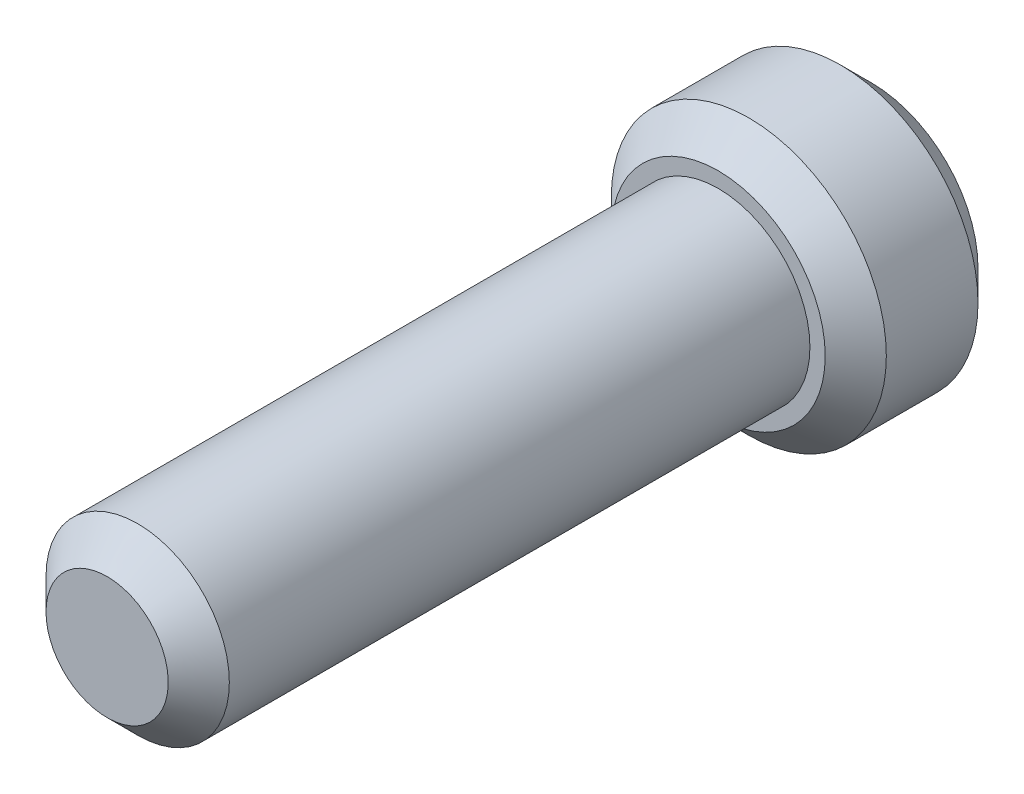
ISO-10303-21;
HEADER;
FILE_DESCRIPTION(('STEP AP214'),'2;1');
FILE_NAME('part.step','',(''),(''),'','','');
FILE_SCHEMA(('AUTOMOTIVE_DESIGN { 1 0 10303 214 1 1 1 1 }'));
ENDSEC;
DATA;
#1=APPLICATION_CONTEXT('core data for automotive mechanical design processes');
#2=APPLICATION_PROTOCOL_DEFINITION('international standard','automotive_design',2000,#1);
#3=PRODUCT_CONTEXT('',#1,'mechanical');
#4=PRODUCT('Part','Part','',(#3));
#5=PRODUCT_RELATED_PRODUCT_CATEGORY('part','',(#4));
#6=PRODUCT_DEFINITION_FORMATION('','',#4);
#7=PRODUCT_DEFINITION_CONTEXT('part definition',#1,'design');
#8=PRODUCT_DEFINITION('design','',#6,#7);
#9=PRODUCT_DEFINITION_SHAPE('','',#8);
#10=(LENGTH_UNIT() NAMED_UNIT(*) SI_UNIT(.MILLI.,.METRE.));
#11=(NAMED_UNIT(*) PLANE_ANGLE_UNIT() SI_UNIT($,.RADIAN.));
#12=(NAMED_UNIT(*) SI_UNIT($,.STERADIAN.) SOLID_ANGLE_UNIT());
#13=UNCERTAINTY_MEASURE_WITH_UNIT(LENGTH_MEASURE(1.E-05),#10,'distance_accuracy_value','');
#14=(GEOMETRIC_REPRESENTATION_CONTEXT(3) GLOBAL_UNCERTAINTY_ASSIGNED_CONTEXT((#13)) GLOBAL_UNIT_ASSIGNED_CONTEXT((#10,
#11,#12)) REPRESENTATION_CONTEXT('',''));
#15=CARTESIAN_POINT('',(0.,0.,0.));
#16=DIRECTION('',(0.,0.,1.));
#17=DIRECTION('',(1.,0.,0.));
#18=AXIS2_PLACEMENT_3D('',#15,#16,#17);
#19=CARTESIAN_POINT('',(-1.299038106,-1.5,1.5));
#20=DIRECTION('',(0.,0.,1.));
#21=DIRECTION('',(1.,0.,0.));
#22=AXIS2_PLACEMENT_3D('',#19,#20,#21);
#23=PLANE('',#22);
#24=DIRECTION('',(-0.866025403838329,0.499999999906659,0.));
#25=VECTOR('',#24,1.);
#26=CARTESIAN_POINT('',(0.,-1.5,1.5));
#27=LINE('',#26,#25);
#28=CARTESIAN_POINT('',(-1.299038105988,-0.750000000006928,1.5));
#29=VERTEX_POINT('',#28);
#30=CARTESIAN_POINT('',(-5.44638257218606E-10,-1.49999999968555,1.5));
#31=VERTEX_POINT('',#30);
#32=EDGE_CURVE('E85',#29,#31,#27,.F.);
#33=ORIENTED_EDGE('',*,*,#32,.F.);
#34=DIRECTION('',(0.,1.,0.));
#35=VECTOR('',#34,1.);
#36=CARTESIAN_POINT('',(-1.299038106,-0.75,1.5));
#37=LINE('',#36,#35);
#38=CARTESIAN_POINT('',(-1.299038106,0.750000000006928,1.5));
#39=VERTEX_POINT('',#38);
#40=EDGE_CURVE('E134',#39,#29,#37,.F.);
#41=ORIENTED_EDGE('',*,*,#40,.F.);
#42=DIRECTION('',(0.866025403838329,0.499999999906659,0.));
#43=VECTOR('',#42,1.);
#44=CARTESIAN_POINT('',(-1.299038106,0.75,1.5));
#45=LINE('',#44,#43);
#46=CARTESIAN_POINT('',(5.44638352086296E-10,1.49999999968555,1.5));
#47=VERTEX_POINT('',#46);
#48=EDGE_CURVE('E128',#47,#39,#45,.F.);
#49=ORIENTED_EDGE('',*,*,#48,.F.);
#50=DIRECTION('',(0.866025403838329,-0.499999999906659,0.));
#51=VECTOR('',#50,1.);
#52=CARTESIAN_POINT('',(0.,1.5,1.5));
#53=LINE('',#52,#51);
#54=CARTESIAN_POINT('',(1.299038105988,0.750000000006928,1.5));
#55=VERTEX_POINT('',#54);
#56=EDGE_CURVE('E74',#55,#47,#53,.F.);
#57=ORIENTED_EDGE('',*,*,#56,.F.);
#58=DIRECTION('',(0.,1.,0.));
#59=VECTOR('',#58,1.);
#60=CARTESIAN_POINT('',(1.299038106,0.75,1.5));
#61=LINE('',#60,#59);
#62=CARTESIAN_POINT('',(1.299038106,-0.750000000006928,1.5));
#63=VERTEX_POINT('',#62);
#64=EDGE_CURVE('E71',#63,#55,#61,.T.);
#65=ORIENTED_EDGE('',*,*,#64,.F.);
#66=DIRECTION('',(-0.866025403838329,-0.499999999906659,0.));
#67=VECTOR('',#66,1.);
#68=CARTESIAN_POINT('',(1.299038106,-0.75,1.5));
#69=LINE('',#68,#67);
#70=EDGE_CURVE('E68',#31,#63,#69,.F.);
#71=ORIENTED_EDGE('',*,*,#70,.F.);
#72=EDGE_LOOP('',(#33,#41,#49,#57,#65,#71));
#73=FACE_BOUND('',#72,.T.);
#74=ADVANCED_FACE('F17',(#73),#23,.F.);
#75=CARTESIAN_POINT('',(1.299038106,0.75,0.));
#76=DIRECTION('',(-1.,0.,0.));
#77=DIRECTION('',(0.,0.,1.));
#78=AXIS2_PLACEMENT_3D('',#75,#76,#77);
#79=PLANE('',#78);
#80=DIRECTION('',(0.,1.,0.));
#81=VECTOR('',#80,1.);
#82=CARTESIAN_POINT('',(1.299038105952,-1.771,0.));
#83=LINE('',#82,#81);
#84=CARTESIAN_POINT('',(1.299038105976,0.750000000013856,0.));
#85=VERTEX_POINT('',#84);
#86=CARTESIAN_POINT('',(1.299038105988,-0.750000000020785,0.));
#87=VERTEX_POINT('',#86);
#88=EDGE_CURVE('E82',#85,#87,#83,.F.);
#89=ORIENTED_EDGE('',*,*,#88,.T.);
#90=DIRECTION('',(0.,0.,1.));
#91=VECTOR('',#90,1.);
#92=CARTESIAN_POINT('',(1.299038106,-0.75,0.));
#93=LINE('',#92,#91);
#94=EDGE_CURVE('E79',#63,#87,#93,.F.);
#95=ORIENTED_EDGE('',*,*,#94,.F.);
#96=ORIENTED_EDGE('',*,*,#64,.T.);
#97=DIRECTION('',(0.,0.,1.));
#98=VECTOR('',#97,1.);
#99=CARTESIAN_POINT('',(1.299038105952,0.750000000027713,0.));
#100=LINE('',#99,#98);
#101=EDGE_CURVE('E121',#85,#55,#100,.T.);
#102=ORIENTED_EDGE('',*,*,#101,.F.);
#103=EDGE_LOOP('',(#89,#95,#96,#102));
#104=FACE_BOUND('',#103,.T.);
#105=ADVANCED_FACE('F80',(#104),#79,.T.);
#106=CARTESIAN_POINT('',(1.299038106,-0.75,0.));
#107=DIRECTION('',(-0.499999999906659,0.866025403838329,0.));
#108=DIRECTION('',(-0.866025403838329,-0.499999999906659,0.));
#109=AXIS2_PLACEMENT_3D('',#106,#107,#108);
#110=PLANE('',#109);
#111=DIRECTION('',(-0.866025403838329,-0.499999999906659,0.));
#112=VECTOR('',#111,1.);
#113=CARTESIAN_POINT('',(1.299038105952,-0.750000000027713,0.));
#114=LINE('',#113,#112);
#115=CARTESIAN_POINT('',(-1.81546044401176E-10,-1.49999999989518,0.));
#116=VERTEX_POINT('',#115);
#117=EDGE_CURVE('E118',#87,#116,#114,.T.);
#118=ORIENTED_EDGE('',*,*,#117,.T.);
#119=DIRECTION('',(0.,0.,1.));
#120=VECTOR('',#119,1.);
#121=CARTESIAN_POINT('',(-7.26184373535166E-10,-1.49999999958074,0.));
#122=LINE('',#121,#120);
#123=EDGE_CURVE('E89',#31,#116,#122,.F.);
#124=ORIENTED_EDGE('',*,*,#123,.F.);
#125=ORIENTED_EDGE('',*,*,#70,.T.);
#126=ORIENTED_EDGE('',*,*,#94,.T.);
#127=EDGE_LOOP('',(#118,#124,#125,#126));
#128=FACE_BOUND('',#127,.T.);
#129=ADVANCED_FACE('F87',(#128),#110,.T.);
#130=CARTESIAN_POINT('',(0.,-1.5,0.));
#131=DIRECTION('',(0.499999999906659,0.866025403838329,0.));
#132=DIRECTION('',(-0.866025403838329,0.499999999906659,0.));
#133=AXIS2_PLACEMENT_3D('',#130,#131,#132);
#134=PLANE('',#133);
#135=DIRECTION('',(-0.866025403838329,0.499999999906659,0.));
#136=VECTOR('',#135,1.);
#137=CARTESIAN_POINT('',(0.,-1.5,0.));
#138=LINE('',#137,#136);
#139=CARTESIAN_POINT('',(-1.299038105964,-0.750000000020785,0.));
#140=VERTEX_POINT('',#139);
#141=EDGE_CURVE('E116',#116,#140,#138,.T.);
#142=ORIENTED_EDGE('',*,*,#141,.T.);
#143=DIRECTION('',(0.,0.,-1.));
#144=VECTOR('',#143,1.);
#145=CARTESIAN_POINT('',(-1.299038106,-0.75,0.));
#146=LINE('',#145,#144);
#147=EDGE_CURVE('E131',#29,#140,#146,.T.);
#148=ORIENTED_EDGE('',*,*,#147,.F.);
#149=ORIENTED_EDGE('',*,*,#32,.T.);
#150=ORIENTED_EDGE('',*,*,#123,.T.);
#151=EDGE_LOOP('',(#142,#148,#149,#150));
#152=FACE_BOUND('',#151,.T.);
#153=ADVANCED_FACE('F139',(#152),#134,.T.);
#154=CARTESIAN_POINT('',(-1.299038106,-0.75,0.));
#155=DIRECTION('',(1.,0.,0.));
#156=DIRECTION('',(0.,0.,-1.));
#157=AXIS2_PLACEMENT_3D('',#154,#155,#156);
#158=PLANE('',#157);
#159=DIRECTION('',(0.,1.,0.));
#160=VECTOR('',#159,1.);
#161=CARTESIAN_POINT('',(-1.299038105952,-1.771,0.));
#162=LINE('',#161,#160);
#163=CARTESIAN_POINT('',(-1.299038105988,0.750000000020785,0.));
#164=VERTEX_POINT('',#163);
#165=EDGE_CURVE('E114',#140,#164,#162,.T.);
#166=ORIENTED_EDGE('',*,*,#165,.T.);
#167=DIRECTION('',(0.,0.,1.));
#168=VECTOR('',#167,1.);
#169=CARTESIAN_POINT('',(-1.299038106,0.75,0.));
#170=LINE('',#169,#168);
#171=EDGE_CURVE('E126',#39,#164,#170,.F.);
#172=ORIENTED_EDGE('',*,*,#171,.F.);
#173=ORIENTED_EDGE('',*,*,#40,.T.);
#174=ORIENTED_EDGE('',*,*,#147,.T.);
#175=EDGE_LOOP('',(#166,#172,#173,#174));
#176=FACE_BOUND('',#175,.T.);
#177=ADVANCED_FACE('F143',(#176),#158,.T.);
#178=CARTESIAN_POINT('',(-1.299038106,0.75,0.));
#179=DIRECTION('',(0.499999999906659,-0.866025403838329,0.));
#180=DIRECTION('',(0.866025403838329,0.499999999906659,0.));
#181=AXIS2_PLACEMENT_3D('',#178,#179,#180);
#182=PLANE('',#181);
#183=DIRECTION('',(0.866025403838329,0.499999999906659,0.));
#184=VECTOR('',#183,1.);
#185=CARTESIAN_POINT('',(-1.299038105952,0.750000000027713,0.));
#186=LINE('',#185,#184);
#187=CARTESIAN_POINT('',(1.81546091835022E-10,1.49999999989518,0.));
#188=VERTEX_POINT('',#187);
#189=EDGE_CURVE('E35',#164,#188,#186,.T.);
#190=ORIENTED_EDGE('',*,*,#189,.T.);
#191=DIRECTION('',(0.,0.,1.));
#192=VECTOR('',#191,1.);
#193=CARTESIAN_POINT('',(7.26184373535166E-10,1.49999999958074,0.));
#194=LINE('',#193,#192);
#195=EDGE_CURVE('E123',#47,#188,#194,.F.);
#196=ORIENTED_EDGE('',*,*,#195,.F.);
#197=ORIENTED_EDGE('',*,*,#48,.T.);
#198=ORIENTED_EDGE('',*,*,#171,.T.);
#199=EDGE_LOOP('',(#190,#196,#197,#198));
#200=FACE_BOUND('',#199,.T.);
#201=ADVANCED_FACE('F145',(#200),#182,.T.);
#202=CARTESIAN_POINT('',(0.,1.5,0.));
#203=DIRECTION('',(-0.499999999906659,-0.866025403838329,0.));
#204=DIRECTION('',(0.866025403838329,-0.499999999906659,0.));
#205=AXIS2_PLACEMENT_3D('',#202,#203,#204);
#206=PLANE('',#205);
#207=DIRECTION('',(0.866025403838329,-0.499999999906659,0.));
#208=VECTOR('',#207,1.);
#209=CARTESIAN_POINT('',(0.,1.5,0.));
#210=LINE('',#209,#208);
#211=EDGE_CURVE('E110',#188,#85,#210,.T.);
#212=ORIENTED_EDGE('',*,*,#211,.T.);
#213=ORIENTED_EDGE('',*,*,#101,.T.);
#214=ORIENTED_EDGE('',*,*,#56,.T.);
#215=ORIENTED_EDGE('',*,*,#195,.T.);
#216=EDGE_LOOP('',(#212,#213,#214,#215));
#217=FACE_BOUND('',#216,.T.);
#218=ADVANCED_FACE('F148',(#217),#206,.T.);
#219=CARTESIAN_POINT('',(-1.771,-1.771,0.));
#220=DIRECTION('',(0.,0.,1.));
#221=DIRECTION('',(1.,0.,0.));
#222=AXIS2_PLACEMENT_3D('',#219,#220,#221);
#223=PLANE('',#222);
#224=CARTESIAN_POINT('',(0.,0.,0.));
#225=DIRECTION('',(0.,0.,1.));
#226=DIRECTION('',(1.,0.,0.));
#227=AXIS2_PLACEMENT_3D('',#224,#225,#226);
#228=CIRCLE('',#227,1.75000000001546);
#229=CARTESIAN_POINT('',(1.75000000001546,0.,0.));
#230=VERTEX_POINT('',#229);
#231=EDGE_CURVE('E20',#230,#230,#228,.T.);
#232=ORIENTED_EDGE('',*,*,#231,.F.);
#233=EDGE_LOOP('',(#232));
#234=FACE_BOUND('',#233,.T.);
#235=ORIENTED_EDGE('',*,*,#189,.F.);
#236=ORIENTED_EDGE('',*,*,#165,.F.);
#237=ORIENTED_EDGE('',*,*,#141,.F.);
#238=ORIENTED_EDGE('',*,*,#117,.F.);
#239=ORIENTED_EDGE('',*,*,#88,.F.);
#240=ORIENTED_EDGE('',*,*,#211,.F.);
#241=EDGE_LOOP('',(#235,#236,#237,#238,#239,#240));
#242=FACE_BOUND('',#241,.T.);
#243=ADVANCED_FACE('F150',(#234,#242),#223,.F.);
#244=CARTESIAN_POINT('',(0.,0.,0.499999999988177));
#245=DIRECTION('',(0.,0.,1.));
#246=DIRECTION('',(1.,0.,0.));
#247=AXIS2_PLACEMENT_3D('',#244,#245,#246);
#248=CONICAL_SURFACE('',#247,2.25000000000364,0.785398163397448);
#249=CARTESIAN_POINT('',(0.,0.,0.499999999999945));
#250=DIRECTION('',(0.,0.,-1.));
#251=DIRECTION('',(-1.,0.,0.));
#252=AXIS2_PLACEMENT_3D('',#249,#250,#251);
#253=CIRCLE('',#252,2.25);
#254=CARTESIAN_POINT('',(-2.25,0.,0.499999999999945));
#255=VERTEX_POINT('',#254);
#256=EDGE_CURVE('E102',#255,#255,#253,.F.);
#257=ORIENTED_EDGE('',*,*,#256,.F.);
#258=EDGE_LOOP('',(#257));
#259=FACE_BOUND('',#258,.T.);
#260=ORIENTED_EDGE('',*,*,#231,.T.);
#261=EDGE_LOOP('',(#260));
#262=FACE_BOUND('',#261,.T.);
#263=ADVANCED_FACE('F152',(#259,#262),#248,.T.);
#264=CARTESIAN_POINT('',(0.,0.,2.));
#265=DIRECTION('',(0.,0.,-1.));
#266=DIRECTION('',(-1.,0.,0.));
#267=AXIS2_PLACEMENT_3D('',#264,#265,#266);
#268=CYLINDRICAL_SURFACE('',#267,2.25);
#269=ORIENTED_EDGE('',*,*,#256,.T.);
#270=EDGE_LOOP('',(#269));
#271=FACE_BOUND('',#270,.T.);
#272=CARTESIAN_POINT('',(0.,0.,2.00000000006639));
#273=DIRECTION('',(0.,0.,-1.));
#274=DIRECTION('',(0.,1.,0.));
#275=AXIS2_PLACEMENT_3D('',#272,#273,#274);
#276=CIRCLE('',#275,2.24999999994679);
#277=CARTESIAN_POINT('',(0.,2.24999999994679,2.00000000006639));
#278=VERTEX_POINT('',#277);
#279=EDGE_CURVE('E98',#278,#278,#276,.F.);
#280=ORIENTED_EDGE('',*,*,#279,.F.);
#281=EDGE_LOOP('',(#280));
#282=FACE_BOUND('',#281,.T.);
#283=ADVANCED_FACE('F160',(#271,#282),#268,.T.);
#284=CARTESIAN_POINT('',(0.,0.,12.5));
#285=DIRECTION('',(0.,0.,1.));
#286=DIRECTION('',(1.,0.,0.));
#287=AXIS2_PLACEMENT_3D('',#284,#285,#286);
#288=PLANE('',#287);
#289=CARTESIAN_POINT('',(0.,0.,12.4999999999886));
#290=DIRECTION('',(0.,0.,-1.));
#291=DIRECTION('',(-1.,0.,0.));
#292=AXIS2_PLACEMENT_3D('',#289,#290,#291);
#293=CIRCLE('',#292,0.99999999991951);
#294=CARTESIAN_POINT('',(-0.99999999991951,0.,12.4999999999886));
#295=VERTEX_POINT('',#294);
#296=EDGE_CURVE('E96',#295,#295,#293,.T.);
#297=ORIENTED_EDGE('',*,*,#296,.F.);
#298=EDGE_LOOP('',(#297));
#299=FACE_BOUND('',#298,.T.);
#300=ADVANCED_FACE('F184',(#299),#288,.T.);
#301=CARTESIAN_POINT('',(0.,0.,2.00000000018008));
#302=DIRECTION('',(0.,0.,-1.));
#303=DIRECTION('',(-1.,0.,0.));
#304=AXIS2_PLACEMENT_3D('',#301,#302,#303);
#305=CONICAL_SURFACE('',#304,2.24999999983311,0.785398163397448);
#306=ORIENTED_EDGE('',*,*,#279,.T.);
#307=EDGE_LOOP('',(#306));
#308=FACE_BOUND('',#307,.T.);
#309=CARTESIAN_POINT('',(0.,0.,2.50000000005457));
#310=DIRECTION('',(0.,0.,-1.));
#311=DIRECTION('',(-1.,0.,0.));
#312=AXIS2_PLACEMENT_3D('',#309,#310,#311);
#313=CIRCLE('',#312,1.74999999995862);
#314=CARTESIAN_POINT('',(-1.74999999995862,0.,2.50000000005457));
#315=VERTEX_POINT('',#314);
#316=EDGE_CURVE('E94',#315,#315,#313,.F.);
#317=ORIENTED_EDGE('',*,*,#316,.F.);
#318=EDGE_LOOP('',(#317));
#319=FACE_BOUND('',#318,.T.);
#320=ADVANCED_FACE('F180',(#308,#319),#305,.T.);
#321=CARTESIAN_POINT('',(0.,0.,12.0000000000573));
#322=DIRECTION('',(0.,0.,-1.));
#323=DIRECTION('',(-1.,0.,0.));
#324=AXIS2_PLACEMENT_3D('',#321,#322,#323);
#325=CONICAL_SURFACE('',#324,1.49999999985084,0.785398163397448);
#326=CARTESIAN_POINT('',(0.,0.,12.));
#327=DIRECTION('',(0.,0.,-1.));
#328=DIRECTION('',(-1.,0.,0.));
#329=AXIS2_PLACEMENT_3D('',#326,#327,#328);
#330=CIRCLE('',#329,1.5);
#331=CARTESIAN_POINT('',(-1.5,0.,12.));
#332=VERTEX_POINT('',#331);
#333=EDGE_CURVE('E26',#332,#332,#330,.T.);
#334=ORIENTED_EDGE('',*,*,#333,.F.);
#335=EDGE_LOOP('',(#334));
#336=FACE_BOUND('',#335,.T.);
#337=ORIENTED_EDGE('',*,*,#296,.T.);
#338=EDGE_LOOP('',(#337));
#339=FACE_BOUND('',#338,.T.);
#340=ADVANCED_FACE('F173',(#336,#339),#325,.T.);
#341=CARTESIAN_POINT('',(-1.771,-1.771,2.5));
#342=DIRECTION('',(0.,0.,1.));
#343=DIRECTION('',(1.,0.,0.));
#344=AXIS2_PLACEMENT_3D('',#341,#342,#343);
#345=PLANE('',#344);
#346=ORIENTED_EDGE('',*,*,#316,.T.);
#347=EDGE_LOOP('',(#346));
#348=FACE_BOUND('',#347,.T.);
#349=CARTESIAN_POINT('',(0.,0.,2.5));
#350=DIRECTION('',(0.,0.,-1.));
#351=DIRECTION('',(-1.,0.,0.));
#352=AXIS2_PLACEMENT_3D('',#349,#350,#351);
#353=CIRCLE('',#352,1.5);
#354=CARTESIAN_POINT('',(-1.5,0.,2.5));
#355=VERTEX_POINT('',#354);
#356=EDGE_CURVE('E11',#355,#355,#353,.F.);
#357=ORIENTED_EDGE('',*,*,#356,.F.);
#358=EDGE_LOOP('',(#357));
#359=FACE_BOUND('',#358,.T.);
#360=ADVANCED_FACE('F167',(#348,#359),#345,.T.);
#361=CARTESIAN_POINT('',(0.,0.,10.5));
#362=DIRECTION('',(0.,0.,-1.));
#363=DIRECTION('',(-1.,0.,0.));
#364=AXIS2_PLACEMENT_3D('',#361,#362,#363);
#365=CYLINDRICAL_SURFACE('',#364,1.5);
#366=ORIENTED_EDGE('',*,*,#356,.T.);
#367=EDGE_LOOP('',(#366));
#368=FACE_BOUND('',#367,.T.);
#369=ORIENTED_EDGE('',*,*,#333,.T.);
#370=EDGE_LOOP('',(#369));
#371=FACE_BOUND('',#370,.T.);
#372=ADVANCED_FACE('F165',(#368,#371),#365,.T.);
#373=CLOSED_SHELL('',(#74,#105,#129,#153,#177,#201,#218,#243,#263,#283,#300,#320,#340,#360,#372));
#374=MANIFOLD_SOLID_BREP('B1',#373);
#375=ADVANCED_BREP_SHAPE_REPRESENTATION('',(#18,#374),#14);
#376=SHAPE_DEFINITION_REPRESENTATION(#9,#375);
ENDSEC;
END-ISO-10303-21;
